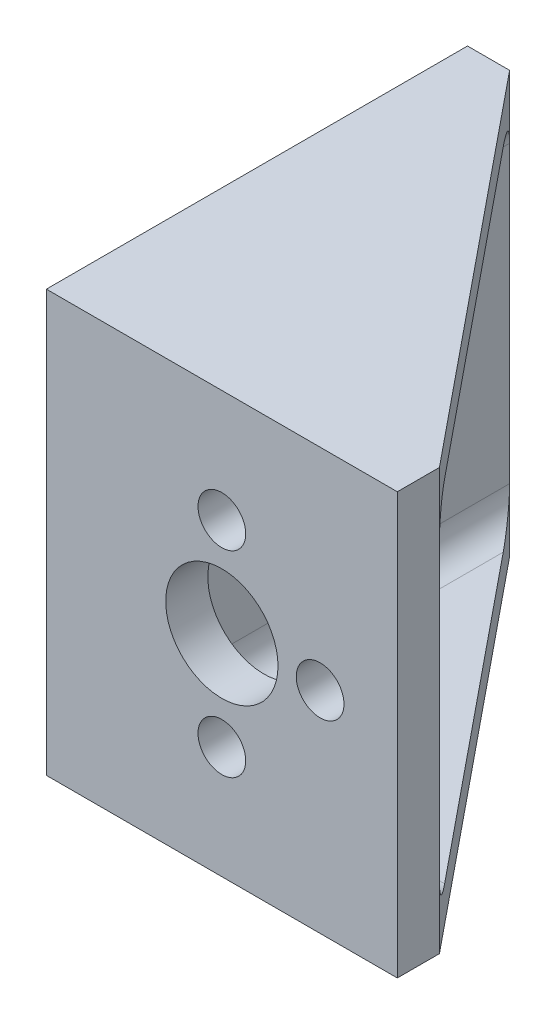
ISO-10303-21;
HEADER;
FILE_DESCRIPTION(('STEP AP214'),'2;1');
FILE_NAME('part.step','',(''),(''),'','','');
FILE_SCHEMA(('AUTOMOTIVE_DESIGN { 1 0 10303 214 1 1 1 1 }'));
ENDSEC;
DATA;
#1=APPLICATION_CONTEXT('core data for automotive mechanical design processes');
#2=APPLICATION_PROTOCOL_DEFINITION('international standard','automotive_design',2000,#1);
#3=PRODUCT_CONTEXT('',#1,'mechanical');
#4=PRODUCT('Part','Part','',(#3));
#5=PRODUCT_RELATED_PRODUCT_CATEGORY('part','',(#4));
#6=PRODUCT_DEFINITION_FORMATION('','',#4);
#7=PRODUCT_DEFINITION_CONTEXT('part definition',#1,'design');
#8=PRODUCT_DEFINITION('design','',#6,#7);
#9=PRODUCT_DEFINITION_SHAPE('','',#8);
#10=(LENGTH_UNIT() NAMED_UNIT(*) SI_UNIT(.MILLI.,.METRE.));
#11=(NAMED_UNIT(*) PLANE_ANGLE_UNIT() SI_UNIT($,.RADIAN.));
#12=(NAMED_UNIT(*) SI_UNIT($,.STERADIAN.) SOLID_ANGLE_UNIT());
#13=UNCERTAINTY_MEASURE_WITH_UNIT(LENGTH_MEASURE(1.E-05),#10,'distance_accuracy_value','');
#14=(GEOMETRIC_REPRESENTATION_CONTEXT(3) GLOBAL_UNCERTAINTY_ASSIGNED_CONTEXT((#13)) GLOBAL_UNIT_ASSIGNED_CONTEXT((#10,
#11,#12)) REPRESENTATION_CONTEXT('',''));
#15=CARTESIAN_POINT('',(0.,0.,0.));
#16=DIRECTION('',(0.,0.,1.));
#17=DIRECTION('',(1.,0.,0.));
#18=AXIS2_PLACEMENT_3D('',#15,#16,#17);
#19=CARTESIAN_POINT('',(3.,30.,-3.));
#20=DIRECTION('',(0.,0.,1.));
#21=DIRECTION('',(1.,0.,0.));
#22=AXIS2_PLACEMENT_3D('',#19,#20,#21);
#23=PLANE('',#22);
#24=CARTESIAN_POINT('',(12.5,8.,-3.));
#25=DIRECTION('',(0.,0.,1.));
#26=DIRECTION('',(1.,0.,0.));
#27=AXIS2_PLACEMENT_3D('',#24,#25,#26);
#28=CIRCLE('',#27,1.7);
#29=CARTESIAN_POINT('',(14.2,8.,-3.));
#30=VERTEX_POINT('',#29);
#31=EDGE_CURVE('E192',#30,#30,#28,.T.);
#32=ORIENTED_EDGE('',*,*,#31,.T.);
#33=EDGE_LOOP('',(#32));
#34=FACE_BOUND('',#33,.T.);
#35=CARTESIAN_POINT('',(19.5,15.,-3.));
#36=DIRECTION('',(0.,0.,1.));
#37=DIRECTION('',(1.,0.,0.));
#38=AXIS2_PLACEMENT_3D('',#35,#36,#37);
#39=CIRCLE('',#38,1.7);
#40=CARTESIAN_POINT('',(21.2,15.,-3.));
#41=VERTEX_POINT('',#40);
#42=EDGE_CURVE('E189',#41,#41,#39,.T.);
#43=ORIENTED_EDGE('',*,*,#42,.T.);
#44=EDGE_LOOP('',(#43));
#45=FACE_BOUND('',#44,.T.);
#46=CARTESIAN_POINT('',(12.5,22.,-3.));
#47=DIRECTION('',(0.,0.,1.));
#48=DIRECTION('',(1.,0.,0.));
#49=AXIS2_PLACEMENT_3D('',#46,#47,#48);
#50=CIRCLE('',#49,1.7);
#51=CARTESIAN_POINT('',(14.2,22.,-3.));
#52=VERTEX_POINT('',#51);
#53=EDGE_CURVE('E186',#52,#52,#50,.T.);
#54=ORIENTED_EDGE('',*,*,#53,.T.);
#55=EDGE_LOOP('',(#54));
#56=FACE_BOUND('',#55,.T.);
#57=CARTESIAN_POINT('',(12.5,15.,-3.));
#58=DIRECTION('',(0.,0.,1.));
#59=DIRECTION('',(1.,0.,0.));
#60=AXIS2_PLACEMENT_3D('',#57,#58,#59);
#61=CIRCLE('',#60,4.);
#62=CARTESIAN_POINT('',(16.5,15.,-3.));
#63=VERTEX_POINT('',#62);
#64=EDGE_CURVE('E183',#63,#63,#61,.T.);
#65=ORIENTED_EDGE('',*,*,#64,.T.);
#66=EDGE_LOOP('',(#65));
#67=FACE_BOUND('',#66,.T.);
#68=DIRECTION('',(1.,0.,0.));
#69=VECTOR('',#68,1.);
#70=CARTESIAN_POINT('',(3.,4.5,-3.));
#71=LINE('',#70,#69);
#72=CARTESIAN_POINT('',(25.,4.5,-3.));
#73=VERTEX_POINT('',#72);
#74=CARTESIAN_POINT('',(3.6,4.5,-3.));
#75=VERTEX_POINT('',#74);
#76=EDGE_CURVE('E493',#73,#75,#71,.F.);
#77=ORIENTED_EDGE('',*,*,#76,.T.);
#78=DIRECTION('',(0.,1.,0.));
#79=VECTOR('',#78,1.);
#80=CARTESIAN_POINT('',(3.6,25.5,-3.));
#81=LINE('',#80,#79);
#82=CARTESIAN_POINT('',(3.6,25.5,-3.));
#83=VERTEX_POINT('',#82);
#84=EDGE_CURVE('E50',#75,#83,#81,.T.);
#85=ORIENTED_EDGE('',*,*,#84,.T.);
#86=DIRECTION('',(-1.,0.,0.));
#87=VECTOR('',#86,1.);
#88=CARTESIAN_POINT('',(25.,25.5,-3.));
#89=LINE('',#88,#87);
#90=CARTESIAN_POINT('',(25.,25.5,-3.));
#91=VERTEX_POINT('',#90);
#92=EDGE_CURVE('E313',#83,#91,#89,.F.);
#93=ORIENTED_EDGE('',*,*,#92,.T.);
#94=DIRECTION('',(0.,-1.,0.));
#95=VECTOR('',#94,1.);
#96=CARTESIAN_POINT('',(25.,30.,-3.));
#97=LINE('',#96,#95);
#98=EDGE_CURVE('E240',#91,#73,#97,.T.);
#99=ORIENTED_EDGE('',*,*,#98,.T.);
#100=EDGE_LOOP('',(#77,#85,#93,#99));
#101=FACE_BOUND('',#100,.T.);
#102=ADVANCED_FACE('F40',(#34,#45,#56,#67,#101),#23,.F.);
#103=CARTESIAN_POINT('',(3.,30.,-30.));
#104=DIRECTION('',(-1.,0.,0.));
#105=DIRECTION('',(0.,0.,1.));
#106=AXIS2_PLACEMENT_3D('',#103,#104,#105);
#107=PLANE('',#106);
#108=CARTESIAN_POINT('',(3.,15.,-20.));
#109=DIRECTION('',(-1.,0.,0.));
#110=DIRECTION('',(0.,0.,1.));
#111=AXIS2_PLACEMENT_3D('',#108,#109,#110);
#112=CIRCLE('',#111,2.75);
#113=CARTESIAN_POINT('',(3.,15.,-17.25));
#114=VERTEX_POINT('',#113);
#115=EDGE_CURVE('E416',#114,#114,#112,.T.);
#116=ORIENTED_EDGE('',*,*,#115,.T.);
#117=EDGE_LOOP('',(#116));
#118=FACE_BOUND('',#117,.T.);
#119=DIRECTION('',(0.,0.,-1.));
#120=VECTOR('',#119,1.);
#121=CARTESIAN_POINT('',(3.,25.5,-3.));
#122=LINE('',#121,#120);
#123=CARTESIAN_POINT('',(3.,25.5,-30.));
#124=VERTEX_POINT('',#123);
#125=CARTESIAN_POINT('',(3.,25.5,-3.6));
#126=VERTEX_POINT('',#125);
#127=EDGE_CURVE('E256',#124,#126,#122,.F.);
#128=ORIENTED_EDGE('',*,*,#127,.T.);
#129=DIRECTION('',(0.,-1.,0.));
#130=VECTOR('',#129,1.);
#131=CARTESIAN_POINT('',(3.,4.5,-3.6));
#132=LINE('',#131,#130);
#133=CARTESIAN_POINT('',(3.,4.5,-3.6));
#134=VERTEX_POINT('',#133);
#135=EDGE_CURVE('E67',#126,#134,#132,.T.);
#136=ORIENTED_EDGE('',*,*,#135,.T.);
#137=DIRECTION('',(0.,0.,1.));
#138=VECTOR('',#137,1.);
#139=CARTESIAN_POINT('',(3.,4.5,-30.));
#140=LINE('',#139,#138);
#141=CARTESIAN_POINT('',(3.00000000000001,4.5,-30.));
#142=VERTEX_POINT('',#141);
#143=EDGE_CURVE('E259',#134,#142,#140,.F.);
#144=ORIENTED_EDGE('',*,*,#143,.T.);
#145=DIRECTION('',(0.,-1.,0.));
#146=VECTOR('',#145,1.);
#147=CARTESIAN_POINT('',(3.,30.,-30.));
#148=LINE('',#147,#146);
#149=EDGE_CURVE('E237',#124,#142,#148,.T.);
#150=ORIENTED_EDGE('',*,*,#149,.F.);
#151=EDGE_LOOP('',(#128,#136,#144,#150));
#152=FACE_BOUND('',#151,.T.);
#153=ADVANCED_FACE('F335',(#118,#152),#107,.F.);
#154=CARTESIAN_POINT('',(25.,30.,0.));
#155=DIRECTION('',(0.,0.,-1.));
#156=DIRECTION('',(-1.,0.,0.));
#157=AXIS2_PLACEMENT_3D('',#154,#155,#156);
#158=PLANE('',#157);
#159=CARTESIAN_POINT('',(12.5,8.,0.));
#160=DIRECTION('',(0.,0.,1.));
#161=DIRECTION('',(1.,0.,0.));
#162=AXIS2_PLACEMENT_3D('',#159,#160,#161);
#163=CIRCLE('',#162,1.7);
#164=CARTESIAN_POINT('',(14.2,8.,0.));
#165=VERTEX_POINT('',#164);
#166=EDGE_CURVE('E168',#165,#165,#163,.T.);
#167=ORIENTED_EDGE('',*,*,#166,.F.);
#168=EDGE_LOOP('',(#167));
#169=FACE_BOUND('',#168,.T.);
#170=CARTESIAN_POINT('',(19.5,15.,0.));
#171=DIRECTION('',(0.,0.,1.));
#172=DIRECTION('',(1.,0.,0.));
#173=AXIS2_PLACEMENT_3D('',#170,#171,#172);
#174=CIRCLE('',#173,1.7);
#175=CARTESIAN_POINT('',(21.2,15.,0.));
#176=VERTEX_POINT('',#175);
#177=EDGE_CURVE('E176',#176,#176,#174,.T.);
#178=ORIENTED_EDGE('',*,*,#177,.F.);
#179=EDGE_LOOP('',(#178));
#180=FACE_BOUND('',#179,.T.);
#181=CARTESIAN_POINT('',(12.5,22.,0.));
#182=DIRECTION('',(0.,0.,1.));
#183=DIRECTION('',(1.,0.,0.));
#184=AXIS2_PLACEMENT_3D('',#181,#182,#183);
#185=CIRCLE('',#184,1.7);
#186=CARTESIAN_POINT('',(14.2,22.,0.));
#187=VERTEX_POINT('',#186);
#188=EDGE_CURVE('E172',#187,#187,#185,.T.);
#189=ORIENTED_EDGE('',*,*,#188,.F.);
#190=EDGE_LOOP('',(#189));
#191=FACE_BOUND('',#190,.T.);
#192=CARTESIAN_POINT('',(12.5,15.,0.));
#193=DIRECTION('',(0.,0.,1.));
#194=DIRECTION('',(1.,0.,0.));
#195=AXIS2_PLACEMENT_3D('',#192,#193,#194);
#196=CIRCLE('',#195,4.);
#197=CARTESIAN_POINT('',(16.5,15.,0.));
#198=VERTEX_POINT('',#197);
#199=EDGE_CURVE('E175',#198,#198,#196,.T.);
#200=ORIENTED_EDGE('',*,*,#199,.F.);
#201=EDGE_LOOP('',(#200));
#202=FACE_BOUND('',#201,.T.);
#203=DIRECTION('',(1.,0.,0.));
#204=VECTOR('',#203,1.);
#205=CARTESIAN_POINT('',(25.,0.,0.));
#206=LINE('',#205,#204);
#207=CARTESIAN_POINT('',(0.,0.,0.));
#208=VERTEX_POINT('',#207);
#209=CARTESIAN_POINT('',(25.,0.,0.));
#210=VERTEX_POINT('',#209);
#211=EDGE_CURVE('E210',#208,#210,#206,.T.);
#212=ORIENTED_EDGE('',*,*,#211,.T.);
#213=DIRECTION('',(0.,-1.,0.));
#214=VECTOR('',#213,1.);
#215=CARTESIAN_POINT('',(25.,30.,0.));
#216=LINE('',#215,#214);
#217=CARTESIAN_POINT('',(25.,30.,0.));
#218=VERTEX_POINT('',#217);
#219=EDGE_CURVE('E244',#218,#210,#216,.T.);
#220=ORIENTED_EDGE('',*,*,#219,.F.);
#221=DIRECTION('',(1.,0.,0.));
#222=VECTOR('',#221,1.);
#223=CARTESIAN_POINT('',(25.,30.,0.));
#224=LINE('',#223,#222);
#225=CARTESIAN_POINT('',(0.,30.,0.));
#226=VERTEX_POINT('',#225);
#227=EDGE_CURVE('E213',#226,#218,#224,.T.);
#228=ORIENTED_EDGE('',*,*,#227,.F.);
#229=DIRECTION('',(0.,-1.,0.));
#230=VECTOR('',#229,1.);
#231=CARTESIAN_POINT('',(0.,30.,0.));
#232=LINE('',#231,#230);
#233=EDGE_CURVE('E224',#226,#208,#232,.T.);
#234=ORIENTED_EDGE('',*,*,#233,.T.);
#235=EDGE_LOOP('',(#212,#220,#228,#234));
#236=FACE_BOUND('',#235,.T.);
#237=ADVANCED_FACE('F331',(#169,#180,#191,#202,#236),#158,.F.);
#238=CARTESIAN_POINT('',(25.,30.,-3.));
#239=DIRECTION('',(-1.,0.,0.));
#240=DIRECTION('',(0.,0.,1.));
#241=AXIS2_PLACEMENT_3D('',#238,#239,#240);
#242=PLANE('',#241);
#243=DIRECTION('',(0.,1.,0.));
#244=VECTOR('',#243,1.);
#245=CARTESIAN_POINT('',(25.,30.,-3.));
#246=LINE('',#245,#244);
#247=CARTESIAN_POINT('',(25.,0.,-3.));
#248=VERTEX_POINT('',#247);
#249=EDGE_CURVE('E204',#73,#248,#246,.F.);
#250=ORIENTED_EDGE('',*,*,#249,.F.);
#251=ORIENTED_EDGE('',*,*,#98,.F.);
#252=CARTESIAN_POINT('',(25.,30.,-3.00000000000002));
#253=VERTEX_POINT('',#252);
#254=EDGE_CURVE('E241',#253,#91,#97,.T.);
#255=ORIENTED_EDGE('',*,*,#254,.F.);
#256=DIRECTION('',(0.,0.,-1.));
#257=VECTOR('',#256,1.);
#258=CARTESIAN_POINT('',(25.,30.,-3.));
#259=LINE('',#258,#257);
#260=EDGE_CURVE('E216',#218,#253,#259,.T.);
#261=ORIENTED_EDGE('',*,*,#260,.F.);
#262=ORIENTED_EDGE('',*,*,#219,.T.);
#263=DIRECTION('',(0.,0.,-1.));
#264=VECTOR('',#263,1.);
#265=CARTESIAN_POINT('',(25.,0.,-3.));
#266=LINE('',#265,#264);
#267=EDGE_CURVE('E227',#210,#248,#266,.T.);
#268=ORIENTED_EDGE('',*,*,#267,.T.);
#269=EDGE_LOOP('',(#250,#251,#255,#261,#262,#268));
#270=FACE_BOUND('',#269,.T.);
#271=ADVANCED_FACE('F334',(#270),#242,.F.);
#272=CARTESIAN_POINT('',(0.,30.,-30.));
#273=DIRECTION('',(0.,0.,1.));
#274=DIRECTION('',(1.,0.,0.));
#275=AXIS2_PLACEMENT_3D('',#272,#273,#274);
#276=PLANE('',#275);
#277=DIRECTION('',(0.,-1.,0.));
#278=VECTOR('',#277,1.);
#279=CARTESIAN_POINT('',(0.5,0.,-30.));
#280=LINE('',#279,#278);
#281=CARTESIAN_POINT('',(0.5,22.6655071586947,-30.));
#282=VERTEX_POINT('',#281);
#283=CARTESIAN_POINT('',(0.5,7.33449284130528,-30.));
#284=VERTEX_POINT('',#283);
#285=EDGE_CURVE('E148',#282,#284,#280,.T.);
#286=ORIENTED_EDGE('',*,*,#285,.F.);
#287=DIRECTION('',(-1.,0.,0.));
#288=VECTOR('',#287,1.);
#289=CARTESIAN_POINT('',(0.5,22.6655071586947,-30.));
#290=LINE('',#289,#288);
#291=CARTESIAN_POINT('',(0.,22.6655071586947,-30.));
#292=VERTEX_POINT('',#291);
#293=EDGE_CURVE('E161',#282,#292,#290,.T.);
#294=ORIENTED_EDGE('',*,*,#293,.T.);
#295=DIRECTION('',(0.,-1.,0.));
#296=VECTOR('',#295,1.);
#297=CARTESIAN_POINT('',(0.,30.,-30.));
#298=LINE('',#297,#296);
#299=CARTESIAN_POINT('',(0.,30.,-30.));
#300=VERTEX_POINT('',#299);
#301=EDGE_CURVE('E234',#300,#292,#298,.T.);
#302=ORIENTED_EDGE('',*,*,#301,.F.);
#303=DIRECTION('',(-1.,0.,0.));
#304=VECTOR('',#303,1.);
#305=CARTESIAN_POINT('',(0.,30.,-30.));
#306=LINE('',#305,#304);
#307=CARTESIAN_POINT('',(3.,30.,-30.));
#308=VERTEX_POINT('',#307);
#309=EDGE_CURVE('E220',#308,#300,#306,.T.);
#310=ORIENTED_EDGE('',*,*,#309,.F.);
#311=EDGE_CURVE('E238',#308,#124,#148,.T.);
#312=ORIENTED_EDGE('',*,*,#311,.T.);
#313=ORIENTED_EDGE('',*,*,#149,.T.);
#314=DIRECTION('',(0.,-1.,0.));
#315=VECTOR('',#314,1.);
#316=CARTESIAN_POINT('',(3.00000000000001,30.,-30.));
#317=LINE('',#316,#315);
#318=CARTESIAN_POINT('',(3.,0.,-30.));
#319=VERTEX_POINT('',#318);
#320=EDGE_CURVE('E199',#319,#142,#317,.F.);
#321=ORIENTED_EDGE('',*,*,#320,.F.);
#322=DIRECTION('',(-1.,0.,0.));
#323=VECTOR('',#322,1.);
#324=CARTESIAN_POINT('',(0.,0.,-30.));
#325=LINE('',#324,#323);
#326=CARTESIAN_POINT('',(0.,0.,-30.));
#327=VERTEX_POINT('',#326);
#328=EDGE_CURVE('E229',#319,#327,#325,.T.);
#329=ORIENTED_EDGE('',*,*,#328,.T.);
#330=CARTESIAN_POINT('',(0.,7.33449284130528,-30.));
#331=VERTEX_POINT('',#330);
#332=EDGE_CURVE('E166',#331,#327,#298,.T.);
#333=ORIENTED_EDGE('',*,*,#332,.F.);
#334=DIRECTION('',(-1.,0.,0.));
#335=VECTOR('',#334,1.);
#336=CARTESIAN_POINT('',(0.5,7.33449284130528,-30.));
#337=LINE('',#336,#335);
#338=EDGE_CURVE('E159',#284,#331,#337,.T.);
#339=ORIENTED_EDGE('',*,*,#338,.F.);
#340=EDGE_LOOP('',(#286,#294,#302,#310,#312,#313,#321,#329,#333,#339));
#341=FACE_BOUND('',#340,.T.);
#342=ADVANCED_FACE('F164',(#341),#276,.F.);
#343=CARTESIAN_POINT('',(0.,30.,0.));
#344=DIRECTION('',(1.,0.,0.));
#345=DIRECTION('',(0.,0.,-1.));
#346=AXIS2_PLACEMENT_3D('',#343,#344,#345);
#347=PLANE('',#346);
#348=ORIENTED_EDGE('',*,*,#301,.T.);
#349=CARTESIAN_POINT('',(0.,15.,-20.));
#350=DIRECTION('',(-1.,0.,0.));
#351=DIRECTION('',(0.,0.,1.));
#352=AXIS2_PLACEMENT_3D('',#349,#350,#351);
#353=CIRCLE('',#352,12.6);
#354=EDGE_CURVE('E155',#331,#292,#353,.T.);
#355=ORIENTED_EDGE('',*,*,#354,.F.);
#356=ORIENTED_EDGE('',*,*,#332,.T.);
#357=DIRECTION('',(0.,0.,1.));
#358=VECTOR('',#357,1.);
#359=CARTESIAN_POINT('',(0.,0.,0.));
#360=LINE('',#359,#358);
#361=EDGE_CURVE('E217',#327,#208,#360,.T.);
#362=ORIENTED_EDGE('',*,*,#361,.T.);
#363=ORIENTED_EDGE('',*,*,#233,.F.);
#364=DIRECTION('',(0.,0.,1.));
#365=VECTOR('',#364,1.);
#366=CARTESIAN_POINT('',(0.,30.,0.));
#367=LINE('',#366,#365);
#368=EDGE_CURVE('E222',#300,#226,#367,.T.);
#369=ORIENTED_EDGE('',*,*,#368,.F.);
#370=EDGE_LOOP('',(#348,#355,#356,#362,#363,#369));
#371=FACE_BOUND('',#370,.T.);
#372=ADVANCED_FACE('F348',(#371),#347,.F.);
#373=CARTESIAN_POINT('',(0.,30.,0.));
#374=DIRECTION('',(0.,-1.,0.));
#375=DIRECTION('',(0.,0.,-1.));
#376=AXIS2_PLACEMENT_3D('',#373,#374,#375);
#377=PLANE('',#376);
#378=ORIENTED_EDGE('',*,*,#227,.T.);
#379=ORIENTED_EDGE('',*,*,#260,.T.);
#380=DIRECTION('',(0.631672951162236,0.,0.775234985517289));
#381=VECTOR('',#380,1.);
#382=CARTESIAN_POINT('',(3.,30.,-30.));
#383=LINE('',#382,#381);
#384=EDGE_CURVE('E208',#308,#253,#383,.T.);
#385=ORIENTED_EDGE('',*,*,#384,.F.);
#386=ORIENTED_EDGE('',*,*,#309,.T.);
#387=ORIENTED_EDGE('',*,*,#368,.T.);
#388=EDGE_LOOP('',(#378,#379,#385,#386,#387));
#389=FACE_BOUND('',#388,.T.);
#390=ADVANCED_FACE('F351',(#389),#377,.F.);
#391=CARTESIAN_POINT('',(0.,0.,0.));
#392=DIRECTION('',(0.,-1.,0.));
#393=DIRECTION('',(0.,0.,-1.));
#394=AXIS2_PLACEMENT_3D('',#391,#392,#393);
#395=PLANE('',#394);
#396=ORIENTED_EDGE('',*,*,#328,.F.);
#397=DIRECTION('',(-0.631672951162236,0.,-0.775234985517289));
#398=VECTOR('',#397,1.);
#399=CARTESIAN_POINT('',(25.,0.,-3.));
#400=LINE('',#399,#398);
#401=EDGE_CURVE('E196',#248,#319,#400,.T.);
#402=ORIENTED_EDGE('',*,*,#401,.F.);
#403=ORIENTED_EDGE('',*,*,#267,.F.);
#404=ORIENTED_EDGE('',*,*,#211,.F.);
#405=ORIENTED_EDGE('',*,*,#361,.F.);
#406=EDGE_LOOP('',(#396,#402,#403,#404,#405));
#407=FACE_BOUND('',#406,.T.);
#408=ADVANCED_FACE('F353',(#407),#395,.T.);
#409=CARTESIAN_POINT('',(12.5,27.5,-15.));
#410=DIRECTION('',(0.,1.,0.));
#411=DIRECTION('',(0.,0.,1.));
#412=AXIS2_PLACEMENT_3D('',#409,#410,#411);
#413=PLANE('',#412);
#414=DIRECTION('',(-1.,0.,0.));
#415=VECTOR('',#414,1.);
#416=CARTESIAN_POINT('',(3.,27.5,-5.));
#417=LINE('',#416,#415);
#418=CARTESIAN_POINT('',(23.3703703703704,27.5,-5.00000000000001));
#419=VERTEX_POINT('',#418);
#420=CARTESIAN_POINT('',(5.,27.5,-5.));
#421=VERTEX_POINT('',#420);
#422=EDGE_CURVE('E274',#419,#421,#417,.T.);
#423=ORIENTED_EDGE('',*,*,#422,.T.);
#424=DIRECTION('',(0.,0.,-1.));
#425=VECTOR('',#424,1.);
#426=CARTESIAN_POINT('',(5.,27.5,-30.));
#427=LINE('',#426,#425);
#428=CARTESIAN_POINT('',(5.,27.5,-27.5454545454545));
#429=VERTEX_POINT('',#428);
#430=EDGE_CURVE('E522',#421,#429,#427,.T.);
#431=ORIENTED_EDGE('',*,*,#430,.T.);
#432=DIRECTION('',(0.631672951162236,0.,0.775234985517289));
#433=VECTOR('',#432,1.);
#434=CARTESIAN_POINT('',(3.,27.5,-30.));
#435=LINE('',#434,#433);
#436=EDGE_CURVE('E207',#429,#419,#435,.T.);
#437=ORIENTED_EDGE('',*,*,#436,.T.);
#438=EDGE_LOOP('',(#423,#431,#437));
#439=FACE_BOUND('',#438,.T.);
#440=ADVANCED_FACE('F356',(#439),#413,.F.);
#441=CARTESIAN_POINT('',(3.,30.,-30.));
#442=DIRECTION('',(-0.775234985517289,0.,0.631672951162236));
#443=DIRECTION('',(0.631672951162236,0.,0.775234985517289));
#444=AXIS2_PLACEMENT_3D('',#441,#442,#443);
#445=PLANE('',#444);
#446=ORIENTED_EDGE('',*,*,#254,.T.);
#447=CARTESIAN_POINT('',(23.3703703703704,25.5,-5.));
#448=DIRECTION('',(-0.775234985517289,0.,0.631672951162236));
#449=DIRECTION('',(0.631672951162236,0.,0.775234985517289));
#450=AXIS2_PLACEMENT_3D('',#447,#448,#449);
#451=ELLIPSE('',#450,2.57986292848415,2.);
#452=EDGE_CURVE('E261',#91,#419,#451,.T.);
#453=ORIENTED_EDGE('',*,*,#452,.T.);
#454=ORIENTED_EDGE('',*,*,#436,.F.);
#455=CARTESIAN_POINT('',(5.,25.5,-27.5454545454545));
#456=DIRECTION('',(-0.775234985517289,0.,0.631672951162236));
#457=DIRECTION('',(0.631672951162236,0.,0.775234985517289));
#458=AXIS2_PLACEMENT_3D('',#455,#456,#457);
#459=ELLIPSE('',#458,3.16619541223055,2.);
#460=EDGE_CURVE('E512',#429,#124,#459,.T.);
#461=ORIENTED_EDGE('',*,*,#460,.T.);
#462=ORIENTED_EDGE('',*,*,#311,.F.);
#463=ORIENTED_EDGE('',*,*,#384,.T.);
#464=EDGE_LOOP('',(#446,#453,#454,#461,#462,#463));
#465=FACE_BOUND('',#464,.T.);
#466=ADVANCED_FACE('F361',(#465),#445,.F.);
#467=CARTESIAN_POINT('',(12.5,2.5,-15.));
#468=DIRECTION('',(0.,-1.,0.));
#469=DIRECTION('',(0.,0.,-1.));
#470=AXIS2_PLACEMENT_3D('',#467,#468,#469);
#471=PLANE('',#470);
#472=DIRECTION('',(-0.631672951162236,0.,-0.775234985517289));
#473=VECTOR('',#472,1.);
#474=CARTESIAN_POINT('',(25.,2.5,-3.));
#475=LINE('',#474,#473);
#476=CARTESIAN_POINT('',(23.3703703703704,2.5,-5.));
#477=VERTEX_POINT('',#476);
#478=CARTESIAN_POINT('',(5.,2.5,-27.5454545454545));
#479=VERTEX_POINT('',#478);
#480=EDGE_CURVE('E195',#477,#479,#475,.T.);
#481=ORIENTED_EDGE('',*,*,#480,.T.);
#482=DIRECTION('',(0.,0.,1.));
#483=VECTOR('',#482,1.);
#484=CARTESIAN_POINT('',(5.,2.5,-3.));
#485=LINE('',#484,#483);
#486=CARTESIAN_POINT('',(5.,2.5,-5.));
#487=VERTEX_POINT('',#486);
#488=EDGE_CURVE('E260',#479,#487,#485,.T.);
#489=ORIENTED_EDGE('',*,*,#488,.T.);
#490=DIRECTION('',(1.,0.,0.));
#491=VECTOR('',#490,1.);
#492=CARTESIAN_POINT('',(25.,2.5,-5.));
#493=LINE('',#492,#491);
#494=EDGE_CURVE('E246',#487,#477,#493,.T.);
#495=ORIENTED_EDGE('',*,*,#494,.T.);
#496=EDGE_LOOP('',(#481,#489,#495));
#497=FACE_BOUND('',#496,.T.);
#498=ADVANCED_FACE('F364',(#497),#471,.F.);
#499=CARTESIAN_POINT('',(25.,0.,-3.));
#500=DIRECTION('',(-0.775234985517289,0.,0.631672951162236));
#501=DIRECTION('',(-0.631672951162236,0.,-0.775234985517289));
#502=AXIS2_PLACEMENT_3D('',#499,#500,#501);
#503=PLANE('',#502);
#504=ORIENTED_EDGE('',*,*,#480,.F.);
#505=CARTESIAN_POINT('',(23.3703703703704,4.5,-5.));
#506=DIRECTION('',(-0.775234985517289,0.,0.631672951162236));
#507=DIRECTION('',(-0.631672951162236,0.,-0.775234985517289));
#508=AXIS2_PLACEMENT_3D('',#505,#506,#507);
#509=ELLIPSE('',#508,2.57986292848415,2.);
#510=EDGE_CURVE('E515',#477,#73,#509,.T.);
#511=ORIENTED_EDGE('',*,*,#510,.T.);
#512=ORIENTED_EDGE('',*,*,#249,.T.);
#513=ORIENTED_EDGE('',*,*,#401,.T.);
#514=ORIENTED_EDGE('',*,*,#320,.T.);
#515=CARTESIAN_POINT('',(5.,4.5,-27.5454545454546));
#516=DIRECTION('',(-0.775234985517289,0.,0.631672951162236));
#517=DIRECTION('',(-0.631672951162236,0.,-0.775234985517289));
#518=AXIS2_PLACEMENT_3D('',#515,#516,#517);
#519=ELLIPSE('',#518,3.16619541223055,2.);
#520=EDGE_CURVE('E518',#142,#479,#519,.T.);
#521=ORIENTED_EDGE('',*,*,#520,.T.);
#522=EDGE_LOOP('',(#504,#511,#512,#513,#514,#521));
#523=FACE_BOUND('',#522,.T.);
#524=ADVANCED_FACE('F369',(#523),#503,.F.);
#525=CARTESIAN_POINT('',(12.5,15.,-30.));
#526=DIRECTION('',(0.,0.,1.));
#527=DIRECTION('',(1.,0.,0.));
#528=AXIS2_PLACEMENT_3D('',#525,#526,#527);
#529=CYLINDRICAL_SURFACE('',#528,4.);
#530=ORIENTED_EDGE('',*,*,#199,.T.);
#531=EDGE_LOOP('',(#530));
#532=FACE_BOUND('',#531,.T.);
#533=ORIENTED_EDGE('',*,*,#64,.F.);
#534=EDGE_LOOP('',(#533));
#535=FACE_BOUND('',#534,.T.);
#536=ADVANCED_FACE('F372',(#532,#535),#529,.F.);
#537=CARTESIAN_POINT('',(12.5,22.,-30.));
#538=DIRECTION('',(0.,0.,1.));
#539=DIRECTION('',(1.,0.,0.));
#540=AXIS2_PLACEMENT_3D('',#537,#538,#539);
#541=CYLINDRICAL_SURFACE('',#540,1.7);
#542=ORIENTED_EDGE('',*,*,#188,.T.);
#543=EDGE_LOOP('',(#542));
#544=FACE_BOUND('',#543,.T.);
#545=ORIENTED_EDGE('',*,*,#53,.F.);
#546=EDGE_LOOP('',(#545));
#547=FACE_BOUND('',#546,.T.);
#548=ADVANCED_FACE('F379',(#544,#547),#541,.F.);
#549=CARTESIAN_POINT('',(19.5,15.,-30.));
#550=DIRECTION('',(0.,0.,1.));
#551=DIRECTION('',(1.,0.,0.));
#552=AXIS2_PLACEMENT_3D('',#549,#550,#551);
#553=CYLINDRICAL_SURFACE('',#552,1.7);
#554=ORIENTED_EDGE('',*,*,#177,.T.);
#555=EDGE_LOOP('',(#554));
#556=FACE_BOUND('',#555,.T.);
#557=ORIENTED_EDGE('',*,*,#42,.F.);
#558=EDGE_LOOP('',(#557));
#559=FACE_BOUND('',#558,.T.);
#560=ADVANCED_FACE('F384',(#556,#559),#553,.F.);
#561=CARTESIAN_POINT('',(12.5,8.,-30.));
#562=DIRECTION('',(0.,0.,1.));
#563=DIRECTION('',(1.,0.,0.));
#564=AXIS2_PLACEMENT_3D('',#561,#562,#563);
#565=CYLINDRICAL_SURFACE('',#564,1.7);
#566=ORIENTED_EDGE('',*,*,#166,.T.);
#567=EDGE_LOOP('',(#566));
#568=FACE_BOUND('',#567,.T.);
#569=ORIENTED_EDGE('',*,*,#31,.F.);
#570=EDGE_LOOP('',(#569));
#571=FACE_BOUND('',#570,.T.);
#572=ADVANCED_FACE('F381',(#568,#571),#565,.F.);
#573=CARTESIAN_POINT('',(0.5,15.,-20.));
#574=DIRECTION('',(-1.,0.,0.));
#575=DIRECTION('',(0.,0.,1.));
#576=AXIS2_PLACEMENT_3D('',#573,#574,#575);
#577=CYLINDRICAL_SURFACE('',#576,12.6);
#578=ORIENTED_EDGE('',*,*,#354,.T.);
#579=ORIENTED_EDGE('',*,*,#293,.F.);
#580=CARTESIAN_POINT('',(0.5,15.,-20.));
#581=DIRECTION('',(-1.,0.,0.));
#582=DIRECTION('',(0.,0.,1.));
#583=AXIS2_PLACEMENT_3D('',#580,#581,#582);
#584=CIRCLE('',#583,12.6);
#585=EDGE_CURVE('E151',#284,#282,#584,.T.);
#586=ORIENTED_EDGE('',*,*,#585,.F.);
#587=ORIENTED_EDGE('',*,*,#338,.T.);
#588=EDGE_LOOP('',(#578,#579,#586,#587));
#589=FACE_BOUND('',#588,.T.);
#590=ADVANCED_FACE('F158',(#589),#577,.F.);
#591=CARTESIAN_POINT('',(0.5,0.,0.));
#592=DIRECTION('',(-1.,0.,0.));
#593=DIRECTION('',(0.,0.,1.));
#594=AXIS2_PLACEMENT_3D('',#591,#592,#593);
#595=PLANE('',#594);
#596=CARTESIAN_POINT('',(0.5,15.,-20.));
#597=DIRECTION('',(-1.,0.,0.));
#598=DIRECTION('',(0.,0.,1.));
#599=AXIS2_PLACEMENT_3D('',#596,#597,#598);
#600=CIRCLE('',#599,2.15);
#601=CARTESIAN_POINT('',(0.5,15.,-17.85));
#602=VERTEX_POINT('',#601);
#603=EDGE_CURVE('E247',#602,#602,#600,.T.);
#604=ORIENTED_EDGE('',*,*,#603,.F.);
#605=EDGE_LOOP('',(#604));
#606=FACE_BOUND('',#605,.T.);
#607=ORIENTED_EDGE('',*,*,#285,.T.);
#608=ORIENTED_EDGE('',*,*,#585,.T.);
#609=EDGE_LOOP('',(#607,#608));
#610=FACE_BOUND('',#609,.T.);
#611=ADVANCED_FACE('F150',(#606,#610),#595,.T.);
#612=CARTESIAN_POINT('',(0.,15.,-20.));
#613=DIRECTION('',(1.,0.,0.));
#614=DIRECTION('',(0.,0.,-1.));
#615=AXIS2_PLACEMENT_3D('',#612,#613,#614);
#616=CYLINDRICAL_SURFACE('',#615,2.15);
#617=CARTESIAN_POINT('',(2.4,15.,-20.));
#618=DIRECTION('',(-1.,0.,0.));
#619=DIRECTION('',(0.,0.,1.));
#620=AXIS2_PLACEMENT_3D('',#617,#618,#619);
#621=CIRCLE('',#620,2.15);
#622=CARTESIAN_POINT('',(2.4,15.,-17.85));
#623=VERTEX_POINT('',#622);
#624=EDGE_CURVE('E12',#623,#623,#621,.F.);
#625=ORIENTED_EDGE('',*,*,#624,.T.);
#626=EDGE_LOOP('',(#625));
#627=FACE_BOUND('',#626,.T.);
#628=ORIENTED_EDGE('',*,*,#603,.T.);
#629=EDGE_LOOP('',(#628));
#630=FACE_BOUND('',#629,.T.);
#631=ADVANCED_FACE('F396',(#627,#630),#616,.F.);
#632=CARTESIAN_POINT('',(12.5,4.5,-5.));
#633=DIRECTION('',(-1.,0.,0.));
#634=DIRECTION('',(0.,0.,1.));
#635=AXIS2_PLACEMENT_3D('',#632,#633,#634);
#636=CYLINDRICAL_SURFACE('',#635,2.);
#637=ORIENTED_EDGE('',*,*,#494,.F.);
#638=CARTESIAN_POINT('',(3.6,4.5,-3.));
#639=CARTESIAN_POINT('',(3.59999382660945,4.36909957447802,-2.99999118087063));
#640=CARTESIAN_POINT('',(3.60902442306023,4.23820456693661,-3.01289203294318));
#641=CARTESIAN_POINT('',(3.64477679181073,3.98143414499887,-3.06396684544389));
#642=CARTESIAN_POINT('',(3.67150325748521,3.85556935956262,-3.10214751069315));
#643=CARTESIAN_POINT('',(3.74163405148319,3.61369691097701,-3.2023343592617));
#644=CARTESIAN_POINT('',(3.78503547670983,3.49769926029749,-3.26433639529975));
#645=CARTESIAN_POINT('',(3.88684960884305,3.28001980762409,-3.40978515549007));
#646=CARTESIAN_POINT('',(3.94525810121472,3.17834701637564,-3.49322585887817));
#647=CARTESIAN_POINT('',(4.07484291146295,2.99322585887817,-3.67834701637563));
#648=CARTESIAN_POINT('',(4.14601386538751,2.90978515544173,-3.78001980769644));
#649=CARTESIAN_POINT('',(4.29838948215761,2.76433639534808,-3.99769926022515));
#650=CARTESIAN_POINT('',(4.37958783779081,2.70233435919844,-4.11369691112973));
#651=CARTESIAN_POINT('',(4.54889855158694,2.60214751075641,-4.35556935940991));
#652=CARTESIAN_POINT('',(4.63700390165171,2.56396684540056,-4.48143414521673));
#653=CARTESIAN_POINT('',(4.81674319670314,2.51289203298652,-4.73820456671876));
#654=CARTESIAN_POINT('',(4.90836970213462,2.49999118087063,-4.86909957447803));
#655=CARTESIAN_POINT('',(5.,2.5,-5.));
#656=B_SPLINE_CURVE_WITH_KNOTS('',3,(#638,#639,#640,#641,#642,#643,#644,#645,#646,#647,#648,
#649,#650,#651,#652,#653,#654,#655),.UNSPECIFIED.,.F.,.F.,(4,2,2,2,2,2,2,2,4),(1.5707963267949,
1.76714586764426,1.96349540849362,2.15984494934298,2.35619449019234,2.55254403104171,
2.74889357189107,2.94524311274043,3.14159265358979),.UNSPECIFIED.);
#657=EDGE_CURVE('E58',#487,#75,#656,.F.);
#658=ORIENTED_EDGE('',*,*,#657,.T.);
#659=ORIENTED_EDGE('',*,*,#76,.F.);
#660=ORIENTED_EDGE('',*,*,#510,.F.);
#661=EDGE_LOOP('',(#637,#658,#659,#660));
#662=FACE_BOUND('',#661,.T.);
#663=ADVANCED_FACE('F288',(#662),#636,.F.);
#664=CARTESIAN_POINT('',(5.,4.5,-15.));
#665=DIRECTION('',(0.,0.,-1.));
#666=DIRECTION('',(-1.,0.,0.));
#667=AXIS2_PLACEMENT_3D('',#664,#665,#666);
#668=CYLINDRICAL_SURFACE('',#667,2.);
#669=ORIENTED_EDGE('',*,*,#143,.F.);
#670=CARTESIAN_POINT('',(5.,2.5,-5.));
#671=CARTESIAN_POINT('',(4.86909957447803,2.49999118087064,-4.90836970213462));
#672=CARTESIAN_POINT('',(4.73820456671877,2.51289203298652,-4.81674319670313));
#673=CARTESIAN_POINT('',(4.48143414521673,2.56396684540056,-4.63700390165171));
#674=CARTESIAN_POINT('',(4.35556935940992,2.60214751075641,-4.54889855158694));
#675=CARTESIAN_POINT('',(4.11369691112973,2.70233435919845,-4.37958783779081));
#676=CARTESIAN_POINT('',(3.99769926022516,2.76433639534809,-4.2983894821576));
#677=CARTESIAN_POINT('',(3.78001980769645,2.90978515544174,-4.14601386538751));
#678=CARTESIAN_POINT('',(3.67834701637564,2.99322585887818,-4.07484291146294));
#679=CARTESIAN_POINT('',(3.49322585887818,3.17834701637564,-3.94525810121472));
#680=CARTESIAN_POINT('',(3.40978515549008,3.2800198076241,-3.88684960884305));
#681=CARTESIAN_POINT('',(3.26433639529975,3.49769926029749,-3.78503547670983));
#682=CARTESIAN_POINT('',(3.20233435926171,3.61369691097702,-3.74163405148319));
#683=CARTESIAN_POINT('',(3.10214751069316,3.85556935956262,-3.67150325748521));
#684=CARTESIAN_POINT('',(3.0639668454439,3.98143414499887,-3.64477679181073));
#685=CARTESIAN_POINT('',(3.01289203294319,4.23820456693662,-3.60902442306023));
#686=CARTESIAN_POINT('',(2.99999118087064,4.36909957447802,-3.59999382660944));
#687=CARTESIAN_POINT('',(3.00000000000001,4.5,-3.6));
#688=B_SPLINE_CURVE_WITH_KNOTS('',3,(#670,#671,#672,#673,#674,#675,#676,#677,#678,#679,#680,
#681,#682,#683,#684,#685,#686,#687),.UNSPECIFIED.,.F.,.F.,(4,2,2,2,2,2,2,2,4),(1.5707963267949,
1.76714586764426,1.96349540849362,2.15984494934298,2.35619449019234,2.55254403104171,
2.74889357189107,2.94524311274043,3.14159265358979),.UNSPECIFIED.);
#689=EDGE_CURVE('E318',#134,#487,#688,.F.);
#690=ORIENTED_EDGE('',*,*,#689,.T.);
#691=ORIENTED_EDGE('',*,*,#488,.F.);
#692=ORIENTED_EDGE('',*,*,#520,.F.);
#693=EDGE_LOOP('',(#669,#690,#691,#692));
#694=FACE_BOUND('',#693,.T.);
#695=ADVANCED_FACE('F294',(#694),#668,.F.);
#696=CARTESIAN_POINT('',(12.5,25.5,-5.));
#697=DIRECTION('',(1.,0.,0.));
#698=DIRECTION('',(0.,0.,-1.));
#699=AXIS2_PLACEMENT_3D('',#696,#697,#698);
#700=CYLINDRICAL_SURFACE('',#699,2.);
#701=ORIENTED_EDGE('',*,*,#92,.F.);
#702=CARTESIAN_POINT('',(5.,27.5,-5.));
#703=CARTESIAN_POINT('',(4.90836970213462,27.5000088191294,-4.86909957447802));
#704=CARTESIAN_POINT('',(4.81674319670314,27.4871079670135,-4.73820456671876));
#705=CARTESIAN_POINT('',(4.63700390165171,27.4360331545994,-4.48143414521673));
#706=CARTESIAN_POINT('',(4.54889855158695,27.3978524892436,-4.35556935940992));
#707=CARTESIAN_POINT('',(4.37958783779081,27.2976656408016,-4.11369691112973));
#708=CARTESIAN_POINT('',(4.29838948215761,27.2356636046519,-3.99769926022515));
#709=CARTESIAN_POINT('',(4.14601386538751,27.0902148445583,-3.78001980769645));
#710=CARTESIAN_POINT('',(4.07484291146295,27.0067741411218,-3.67834701637564));
#711=CARTESIAN_POINT('',(3.94525810121473,26.8216529836244,-3.49322585887818));
#712=CARTESIAN_POINT('',(3.88684960884306,26.7199801923759,-3.40978515549007));
#713=CARTESIAN_POINT('',(3.78503547670983,26.5023007397025,-3.26433639529975));
#714=CARTESIAN_POINT('',(3.74163405148319,26.386303089023,-3.2023343592617));
#715=CARTESIAN_POINT('',(3.67150325748521,26.1444306404374,-3.10214751069315));
#716=CARTESIAN_POINT('',(3.64477679181073,26.0185658550011,-3.06396684544389));
#717=CARTESIAN_POINT('',(3.60902442306023,25.7617954330634,-3.01289203294318));
#718=CARTESIAN_POINT('',(3.59999382660945,25.630900425522,-2.99999118087063));
#719=CARTESIAN_POINT('',(3.6,25.5,-3.));
#720=B_SPLINE_CURVE_WITH_KNOTS('',3,(#702,#703,#704,#705,#706,#707,#708,#709,#710,#711,#712,
#713,#714,#715,#716,#717,#718,#719),.UNSPECIFIED.,.F.,.F.,(4,2,2,2,2,2,2,2,4),(4.71238898038469,
4.90873852123405,5.10508806208341,5.30143760293278,5.49778714378214,5.6941366846315,
5.89048622548086,6.08683576633022,6.28318530717959),.UNSPECIFIED.);
#721=EDGE_CURVE('E489',#83,#421,#720,.F.);
#722=ORIENTED_EDGE('',*,*,#721,.T.);
#723=ORIENTED_EDGE('',*,*,#422,.F.);
#724=ORIENTED_EDGE('',*,*,#452,.F.);
#725=EDGE_LOOP('',(#701,#722,#723,#724));
#726=FACE_BOUND('',#725,.T.);
#727=ADVANCED_FACE('F287',(#726),#700,.F.);
#728=CARTESIAN_POINT('',(5.,25.5,-15.));
#729=DIRECTION('',(0.,0.,1.));
#730=DIRECTION('',(1.,0.,0.));
#731=AXIS2_PLACEMENT_3D('',#728,#729,#730);
#732=CYLINDRICAL_SURFACE('',#731,2.);
#733=ORIENTED_EDGE('',*,*,#430,.F.);
#734=CARTESIAN_POINT('',(3.00000000000001,25.5,-3.6));
#735=CARTESIAN_POINT('',(2.99999118087064,25.630900425522,-3.59999382660944));
#736=CARTESIAN_POINT('',(3.01289203294319,25.7617954330634,-3.60902442306023));
#737=CARTESIAN_POINT('',(3.0639668454439,26.0185658550011,-3.64477679181073));
#738=CARTESIAN_POINT('',(3.10214751069316,26.1444306404374,-3.67150325748521));
#739=CARTESIAN_POINT('',(3.20233435926171,26.386303089023,-3.74163405148319));
#740=CARTESIAN_POINT('',(3.26433639529975,26.5023007397025,-3.78503547670982));
#741=CARTESIAN_POINT('',(3.40978515549008,26.7199801923759,-3.88684960884305));
#742=CARTESIAN_POINT('',(3.49322585887819,26.8216529836244,-3.94525810121473));
#743=CARTESIAN_POINT('',(3.67834701637564,27.0067741411218,-4.07484291146295));
#744=CARTESIAN_POINT('',(3.78001980769645,27.0902148445583,-4.14601386538751));
#745=CARTESIAN_POINT('',(3.99769926022516,27.2356636046519,-4.2983894821576));
#746=CARTESIAN_POINT('',(4.11369691112974,27.2976656408016,-4.37958783779081));
#747=CARTESIAN_POINT('',(4.35556935940992,27.3978524892436,-4.54889855158694));
#748=CARTESIAN_POINT('',(4.48143414521673,27.4360331545994,-4.63700390165171));
#749=CARTESIAN_POINT('',(4.73820456671876,27.4871079670135,-4.81674319670313));
#750=CARTESIAN_POINT('',(4.86909957447802,27.5000088191294,-4.90836970213462));
#751=CARTESIAN_POINT('',(5.,27.5,-5.));
#752=B_SPLINE_CURVE_WITH_KNOTS('',3,(#734,#735,#736,#737,#738,#739,#740,#741,#742,#743,#744,
#745,#746,#747,#748,#749,#750,#751),.UNSPECIFIED.,.F.,.F.,(4,2,2,2,2,2,2,2,4),(4.71238898038469,
4.90873852123405,5.10508806208341,5.30143760293277,5.49778714378214,5.6941366846315,
5.89048622548086,6.08683576633022,6.28318530717958),.UNSPECIFIED.);
#753=EDGE_CURVE('E269',#421,#126,#752,.F.);
#754=ORIENTED_EDGE('',*,*,#753,.T.);
#755=ORIENTED_EDGE('',*,*,#127,.F.);
#756=ORIENTED_EDGE('',*,*,#460,.F.);
#757=EDGE_LOOP('',(#733,#754,#755,#756));
#758=FACE_BOUND('',#757,.T.);
#759=ADVANCED_FACE('F276',(#758),#732,.F.);
#760=CARTESIAN_POINT('',(5.,2.5,-5.));
#761=CARTESIAN_POINT('',(4.90836970213462,2.49999118087063,-4.86909957447803));
#762=CARTESIAN_POINT('',(4.81674319670314,2.51289203298652,-4.73820456671876));
#763=CARTESIAN_POINT('',(4.63700390165171,2.56396684540056,-4.48143414521673));
#764=CARTESIAN_POINT('',(4.54889855158694,2.60214751075641,-4.35556935940991));
#765=CARTESIAN_POINT('',(4.37958783779081,2.70233435919844,-4.11369691112973));
#766=CARTESIAN_POINT('',(4.29838948215761,2.76433639534808,-3.99769926022515));
#767=CARTESIAN_POINT('',(4.14601386538751,2.90978515544173,-3.78001980769644));
#768=CARTESIAN_POINT('',(4.07484291146295,2.99322585887817,-3.67834701637563));
#769=CARTESIAN_POINT('',(3.94525810121472,3.17834701637564,-3.49322585887817));
#770=CARTESIAN_POINT('',(3.88684960884305,3.28001980762409,-3.40978515549007));
#771=CARTESIAN_POINT('',(3.78503547670983,3.49769926029749,-3.26433639529975));
#772=CARTESIAN_POINT('',(3.74163405148319,3.61369691097701,-3.2023343592617));
#773=CARTESIAN_POINT('',(3.67150325748521,3.85556935956262,-3.10214751069315));
#774=CARTESIAN_POINT('',(3.64477679181073,3.98143414499887,-3.06396684544389));
#775=CARTESIAN_POINT('',(3.60902442306023,4.23820456693661,-3.01289203294318));
#776=CARTESIAN_POINT('',(3.59999382660945,4.36909957447802,-2.99999118087063));
#777=CARTESIAN_POINT('',(3.6,4.5,-3.));
#778=CARTESIAN_POINT('',(5.,2.5,-5.));
#779=CARTESIAN_POINT('',(4.86909957447803,2.49999118087064,-4.90836970213462));
#780=CARTESIAN_POINT('',(4.73820456671877,2.51289203298652,-4.81674319670313));
#781=CARTESIAN_POINT('',(4.48143414521673,2.56396684540056,-4.63700390165171));
#782=CARTESIAN_POINT('',(4.35556935940992,2.60214751075641,-4.54889855158694));
#783=CARTESIAN_POINT('',(4.11369691112973,2.70233435919845,-4.37958783779081));
#784=CARTESIAN_POINT('',(3.99769926022516,2.76433639534809,-4.2983894821576));
#785=CARTESIAN_POINT('',(3.78001980769645,2.90978515544174,-4.14601386538751));
#786=CARTESIAN_POINT('',(3.67834701637564,2.99322585887818,-4.07484291146294));
#787=CARTESIAN_POINT('',(3.49322585887818,3.17834701637564,-3.94525810121472));
#788=CARTESIAN_POINT('',(3.40978515549008,3.2800198076241,-3.88684960884305));
#789=CARTESIAN_POINT('',(3.26433639529975,3.49769926029749,-3.78503547670983));
#790=CARTESIAN_POINT('',(3.20233435926171,3.61369691097702,-3.74163405148319));
#791=CARTESIAN_POINT('',(3.10214751069316,3.85556935956262,-3.67150325748521));
#792=CARTESIAN_POINT('',(3.0639668454439,3.98143414499887,-3.64477679181073));
#793=CARTESIAN_POINT('',(3.01289203294319,4.23820456693662,-3.60902442306023));
#794=CARTESIAN_POINT('',(2.99999118087064,4.36909957447802,-3.59999382660944));
#795=CARTESIAN_POINT('',(3.00000000000001,4.5,-3.6));
#796=B_SPLINE_SURFACE_WITH_KNOTS('',1,3,((#760,#761,#762,#763,#764,#765,#766,#767,#768,#769,
#770,#771,#772,#773,#774,#775,#776,#777),(#778,#779,#780,#781,#782,#783,#784,#785,#786,#787,
#788,#789,#790,#791,#792,#793,#794,#795)),.UNSPECIFIED.,.F.,.F.,.F.,(2,2),(4,2,2,2,2,2,2,2,4),
(0.,1.),(1.5707963267949,1.76714586764426,1.96349540849362,2.15984494934298,2.35619449019234,
2.55254403104171,2.74889357189107,2.94524311274043,3.14159265358979),.UNSPECIFIED.);
#797=CARTESIAN_POINT('',(3.00000000000001,4.5,-3.6));
#798=CARTESIAN_POINT('',(3.6,4.5,-3.));
#799=B_SPLINE_CURVE_WITH_KNOTS('',1,(#797,#798),.UNSPECIFIED.,.F.,.F.,(2,2),(0.,1.),.UNSPECIFIED.);
#800=EDGE_CURVE('E250',#75,#134,#799,.F.);
#801=ORIENTED_EDGE('',*,*,#657,.F.);
#802=ORIENTED_EDGE('',*,*,#689,.F.);
#803=ORIENTED_EDGE('',*,*,#800,.F.);
#804=EDGE_LOOP('',(#801,#802,#803));
#805=FACE_BOUND('',#804,.T.);
#806=ADVANCED_FACE('F286',(#805),#796,.T.);
#807=CARTESIAN_POINT('',(3.,30.,-3.6));
#808=DIRECTION('',(0.707106781186551,0.,-0.707106781186544));
#809=DIRECTION('',(0.,1.,0.));
#810=AXIS2_PLACEMENT_3D('',#807,#808,#809);
#811=PLANE('',#810);
#812=ORIENTED_EDGE('',*,*,#800,.T.);
#813=ORIENTED_EDGE('',*,*,#135,.F.);
#814=CARTESIAN_POINT('',(3.6,25.5,-3.));
#815=CARTESIAN_POINT('',(3.00000000000001,25.5,-3.6));
#816=B_SPLINE_CURVE_WITH_KNOTS('',1,(#814,#815),.UNSPECIFIED.,.F.,.F.,(2,2),(0.,1.),.UNSPECIFIED.);
#817=EDGE_CURVE('E431',#83,#126,#816,.T.);
#818=ORIENTED_EDGE('',*,*,#817,.F.);
#819=ORIENTED_EDGE('',*,*,#84,.F.);
#820=EDGE_LOOP('',(#812,#813,#818,#819));
#821=FACE_BOUND('',#820,.T.);
#822=ADVANCED_FACE('F412',(#821),#811,.T.);
#823=CARTESIAN_POINT('',(5.,27.5,-5.));
#824=CARTESIAN_POINT('',(4.86909957447802,27.5000088191294,-4.90836970213462));
#825=CARTESIAN_POINT('',(4.73820456671876,27.4871079670135,-4.81674319670313));
#826=CARTESIAN_POINT('',(4.48143414521673,27.4360331545994,-4.63700390165171));
#827=CARTESIAN_POINT('',(4.35556935940992,27.3978524892436,-4.54889855158694));
#828=CARTESIAN_POINT('',(4.11369691112974,27.2976656408016,-4.37958783779081));
#829=CARTESIAN_POINT('',(3.99769926022516,27.2356636046519,-4.2983894821576));
#830=CARTESIAN_POINT('',(3.78001980769645,27.0902148445583,-4.14601386538751));
#831=CARTESIAN_POINT('',(3.67834701637564,27.0067741411218,-4.07484291146295));
#832=CARTESIAN_POINT('',(3.49322585887819,26.8216529836244,-3.94525810121473));
#833=CARTESIAN_POINT('',(3.40978515549008,26.7199801923759,-3.88684960884305));
#834=CARTESIAN_POINT('',(3.26433639529975,26.5023007397025,-3.78503547670982));
#835=CARTESIAN_POINT('',(3.20233435926171,26.386303089023,-3.74163405148319));
#836=CARTESIAN_POINT('',(3.10214751069316,26.1444306404374,-3.67150325748521));
#837=CARTESIAN_POINT('',(3.0639668454439,26.0185658550011,-3.64477679181073));
#838=CARTESIAN_POINT('',(3.01289203294319,25.7617954330634,-3.60902442306023));
#839=CARTESIAN_POINT('',(2.99999118087064,25.630900425522,-3.59999382660944));
#840=CARTESIAN_POINT('',(3.00000000000001,25.5,-3.6));
#841=CARTESIAN_POINT('',(5.,27.5,-5.));
#842=CARTESIAN_POINT('',(4.90836970213462,27.5000088191294,-4.86909957447802));
#843=CARTESIAN_POINT('',(4.81674319670314,27.4871079670135,-4.73820456671876));
#844=CARTESIAN_POINT('',(4.63700390165171,27.4360331545994,-4.48143414521673));
#845=CARTESIAN_POINT('',(4.54889855158695,27.3978524892436,-4.35556935940992));
#846=CARTESIAN_POINT('',(4.37958783779081,27.2976656408016,-4.11369691112973));
#847=CARTESIAN_POINT('',(4.29838948215761,27.2356636046519,-3.99769926022515));
#848=CARTESIAN_POINT('',(4.14601386538751,27.0902148445583,-3.78001980769645));
#849=CARTESIAN_POINT('',(4.07484291146295,27.0067741411218,-3.67834701637564));
#850=CARTESIAN_POINT('',(3.94525810121473,26.8216529836244,-3.49322585887818));
#851=CARTESIAN_POINT('',(3.88684960884306,26.7199801923759,-3.40978515549007));
#852=CARTESIAN_POINT('',(3.78503547670983,26.5023007397025,-3.26433639529975));
#853=CARTESIAN_POINT('',(3.74163405148319,26.386303089023,-3.2023343592617));
#854=CARTESIAN_POINT('',(3.67150325748521,26.1444306404374,-3.10214751069315));
#855=CARTESIAN_POINT('',(3.64477679181073,26.0185658550011,-3.06396684544389));
#856=CARTESIAN_POINT('',(3.60902442306023,25.7617954330634,-3.01289203294318));
#857=CARTESIAN_POINT('',(3.59999382660945,25.630900425522,-2.99999118087063));
#858=CARTESIAN_POINT('',(3.6,25.5,-3.));
#859=B_SPLINE_SURFACE_WITH_KNOTS('',1,3,((#823,#824,#825,#826,#827,#828,#829,#830,#831,#832,
#833,#834,#835,#836,#837,#838,#839,#840),(#841,#842,#843,#844,#845,#846,#847,#848,#849,#850,
#851,#852,#853,#854,#855,#856,#857,#858)),.UNSPECIFIED.,.F.,.F.,.F.,(2,2),(4,2,2,2,2,2,2,2,4),
(0.,1.),(4.71238898038469,4.90873852123405,5.10508806208341,5.30143760293278,5.49778714378214,
5.6941366846315,5.89048622548086,6.08683576633022,6.28318530717959),.UNSPECIFIED.);
#860=ORIENTED_EDGE('',*,*,#753,.F.);
#861=ORIENTED_EDGE('',*,*,#721,.F.);
#862=ORIENTED_EDGE('',*,*,#817,.T.);
#863=EDGE_LOOP('',(#860,#861,#862));
#864=FACE_BOUND('',#863,.T.);
#865=ADVANCED_FACE('F296',(#864),#859,.T.);
#866=CARTESIAN_POINT('',(2.4,15.,-20.));
#867=DIRECTION('',(1.,0.,0.));
#868=DIRECTION('',(0.,0.,-1.));
#869=AXIS2_PLACEMENT_3D('',#866,#867,#868);
#870=CONICAL_SURFACE('',#869,2.15,0.785398163397453);
#871=ORIENTED_EDGE('',*,*,#115,.F.);
#872=EDGE_LOOP('',(#871));
#873=FACE_BOUND('',#872,.T.);
#874=ORIENTED_EDGE('',*,*,#624,.F.);
#875=EDGE_LOOP('',(#874));
#876=FACE_BOUND('',#875,.T.);
#877=ADVANCED_FACE('F42',(#873,#876),#870,.F.);
#878=CLOSED_SHELL('',(#102,#153,#237,#271,#342,#372,#390,#408,#440,#466,#498,#524,#536,#548,
#560,#572,#590,#611,#631,#663,#695,#727,#759,#806,#822,#865,#877));
#879=MANIFOLD_SOLID_BREP('B2',#878);
#880=ADVANCED_BREP_SHAPE_REPRESENTATION('',(#18,#879),#14);
#881=SHAPE_DEFINITION_REPRESENTATION(#9,#880);
ENDSEC;
END-ISO-10303-21;
